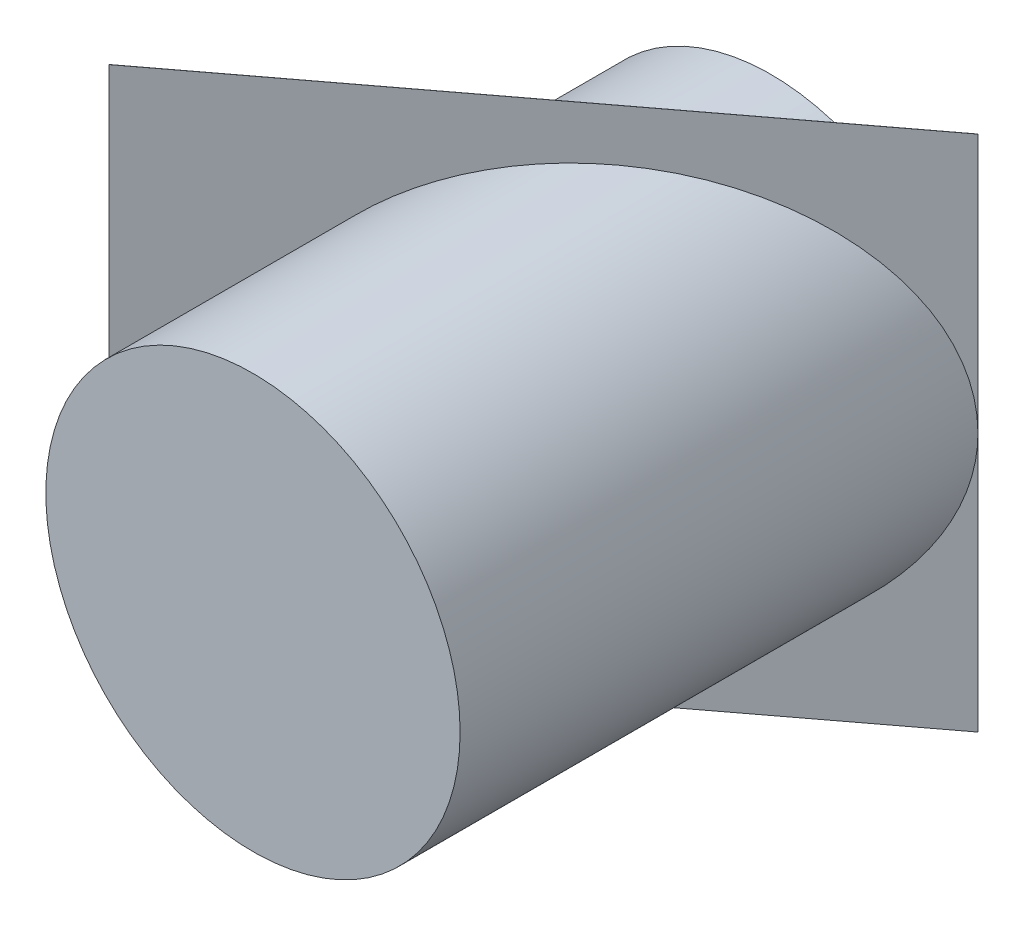
ISO-10303-21;
HEADER;
FILE_DESCRIPTION(('STEP AP214'),'2;1');
FILE_NAME('part.step','',(''),(''),'','','');
FILE_SCHEMA(('AUTOMOTIVE_DESIGN { 1 0 10303 214 1 1 1 1 }'));
ENDSEC;
DATA;
#1=APPLICATION_CONTEXT('core data for automotive mechanical design processes');
#2=APPLICATION_PROTOCOL_DEFINITION('international standard','automotive_design',2000,#1);
#3=PRODUCT_CONTEXT('',#1,'mechanical');
#4=PRODUCT('Part','Part','',(#3));
#5=PRODUCT_RELATED_PRODUCT_CATEGORY('part','',(#4));
#6=PRODUCT_DEFINITION_FORMATION('','',#4);
#7=PRODUCT_DEFINITION_CONTEXT('part definition',#1,'design');
#8=PRODUCT_DEFINITION('design','',#6,#7);
#9=PRODUCT_DEFINITION_SHAPE('','',#8);
#10=(LENGTH_UNIT() NAMED_UNIT(*) SI_UNIT(.MILLI.,.METRE.));
#11=(NAMED_UNIT(*) PLANE_ANGLE_UNIT() SI_UNIT($,.RADIAN.));
#12=(NAMED_UNIT(*) SI_UNIT($,.STERADIAN.) SOLID_ANGLE_UNIT());
#13=UNCERTAINTY_MEASURE_WITH_UNIT(LENGTH_MEASURE(1.E-05),#10,'distance_accuracy_value','');
#14=(GEOMETRIC_REPRESENTATION_CONTEXT(3) GLOBAL_UNCERTAINTY_ASSIGNED_CONTEXT((#13)) GLOBAL_UNIT_ASSIGNED_CONTEXT((#10,
#11,#12)) REPRESENTATION_CONTEXT('',''));
#15=CARTESIAN_POINT('',(0.,0.,0.));
#16=DIRECTION('',(0.,0.,1.));
#17=DIRECTION('',(1.,0.,0.));
#18=AXIS2_PLACEMENT_3D('',#15,#16,#17);
#19=CARTESIAN_POINT('',(0.,0.,50.));
#20=DIRECTION('',(0.,0.,-1.));
#21=DIRECTION('',(-1.,0.,0.));
#22=AXIS2_PLACEMENT_3D('',#19,#20,#21);
#23=CYLINDRICAL_SURFACE('',#22,20.);
#24=CARTESIAN_POINT('',(0.,0.,15.1304782298956));
#25=DIRECTION('',(0.603324589321637,0.,0.797495730345861));
#26=DIRECTION('',(0.797495730345861,0.,-0.603324589321637));
#27=AXIS2_PLACEMENT_3D('',#24,#25,#26);
#28=ELLIPSE('',#27,25.0785041712089,20.);
#29=CARTESIAN_POINT('',(20.,0.,0.));
#30=VERTEX_POINT('',#29);
#31=EDGE_CURVE('E103',#30,#30,#28,.T.);
#32=ORIENTED_EDGE('',*,*,#31,.T.);
#33=EDGE_LOOP('',(#32));
#34=FACE_BOUND('',#33,.T.);
#35=CARTESIAN_POINT('',(0.,0.,50.));
#36=DIRECTION('',(0.,0.,1.));
#37=DIRECTION('',(1.,0.,0.));
#38=AXIS2_PLACEMENT_3D('',#35,#36,#37);
#39=CIRCLE('',#38,20.);
#40=CARTESIAN_POINT('',(20.,0.,50.));
#41=VERTEX_POINT('',#40);
#42=EDGE_CURVE('E42',#41,#41,#39,.T.);
#43=ORIENTED_EDGE('',*,*,#42,.F.);
#44=EDGE_LOOP('',(#43));
#45=FACE_BOUND('',#44,.T.);
#46=ADVANCED_FACE('F35',(#34,#45),#23,.T.);
#47=CARTESIAN_POINT('',(0.,0.,50.));
#48=DIRECTION('',(0.,0.,1.));
#49=DIRECTION('',(1.,0.,0.));
#50=AXIS2_PLACEMENT_3D('',#47,#48,#49);
#51=PLANE('',#50);
#52=ORIENTED_EDGE('',*,*,#42,.T.);
#53=EDGE_LOOP('',(#52));
#54=FACE_BOUND('',#53,.T.);
#55=ADVANCED_FACE('F137',(#54),#51,.T.);
#56=CARTESIAN_POINT('',(19.9939667541068,25.,-0.00797495730345861));
#57=DIRECTION('',(0.603324589321637,0.,0.797495730345861));
#58=DIRECTION('',(0.797495730345861,0.,-0.603324589321637));
#59=AXIS2_PLACEMENT_3D('',#56,#57,#58);
#60=PLANE('',#59);
#61=DIRECTION('',(-0.797495730345861,0.,0.603324589321637));
#62=VECTOR('',#61,1.);
#63=CARTESIAN_POINT('',(19.9939667541068,-25.,-0.00797495730345861));
#64=LINE('',#63,#62);
#65=CARTESIAN_POINT('',(19.9939667541068,-25.,-0.00797495730345861));
#66=VERTEX_POINT('',#65);
#67=CARTESIAN_POINT('',(-27.7617690459737,-25.,36.1203810864847));
#68=VERTEX_POINT('',#67);
#69=EDGE_CURVE('E99',#66,#68,#64,.T.);
#70=ORIENTED_EDGE('',*,*,#69,.T.);
#71=DIRECTION('',(0.,-1.,0.));
#72=VECTOR('',#71,1.);
#73=CARTESIAN_POINT('',(-27.7617690459737,25.,36.1203810864847));
#74=LINE('',#73,#72);
#75=CARTESIAN_POINT('',(-27.7617690459737,25.,36.1203810864847));
#76=VERTEX_POINT('',#75);
#77=EDGE_CURVE('E95',#76,#68,#74,.T.);
#78=ORIENTED_EDGE('',*,*,#77,.F.);
#79=DIRECTION('',(-0.797495730345861,0.,0.603324589321637));
#80=VECTOR('',#79,1.);
#81=CARTESIAN_POINT('',(19.9939667541068,25.,-0.00797495730345861));
#82=LINE('',#81,#80);
#83=CARTESIAN_POINT('',(19.9939667541068,25.,-0.00797495730345861));
#84=VERTEX_POINT('',#83);
#85=EDGE_CURVE('E83',#84,#76,#82,.T.);
#86=ORIENTED_EDGE('',*,*,#85,.F.);
#87=DIRECTION('',(0.,-1.,0.));
#88=VECTOR('',#87,1.);
#89=CARTESIAN_POINT('',(19.9939667541068,25.,-0.00797495730345861));
#90=LINE('',#89,#88);
#91=EDGE_CURVE('E112',#84,#66,#90,.T.);
#92=ORIENTED_EDGE('',*,*,#91,.T.);
#93=EDGE_LOOP('',(#70,#78,#86,#92));
#94=FACE_BOUND('',#93,.T.);
#95=DIRECTION('',(0.,1.,0.));
#96=VECTOR('',#95,1.);
#97=CARTESIAN_POINT('',(19.9834251741484,0.,0.));
#98=LINE('',#97,#96);
#99=CARTESIAN_POINT('',(19.9834251741484,-0.814075125042166,0.));
#100=VERTEX_POINT('',#99);
#101=CARTESIAN_POINT('',(19.9834251741484,0.814075125042166,0.));
#102=VERTEX_POINT('',#101);
#103=EDGE_CURVE('E11',#100,#102,#98,.T.);
#104=ORIENTED_EDGE('',*,*,#103,.T.);
#105=CARTESIAN_POINT('',(0.,0.,15.11793897781));
#106=DIRECTION('',(0.603324589321637,0.,0.797495730345861));
#107=DIRECTION('',(0.797495730345861,0.,-0.603324589321637));
#108=AXIS2_PLACEMENT_3D('',#105,#106,#107);
#109=ELLIPSE('',#108,25.0785041712089,20.);
#110=EDGE_CURVE('E127',#102,#100,#109,.T.);
#111=ORIENTED_EDGE('',*,*,#110,.T.);
#112=EDGE_LOOP('',(#104,#111));
#113=FACE_BOUND('',#112,.T.);
#114=ADVANCED_FACE('F96',(#94,#113),#60,.F.);
#115=CARTESIAN_POINT('',(20.,25.,0.));
#116=DIRECTION('',(0.603324589321637,0.,0.797495730345861));
#117=DIRECTION('',(0.797495730345861,0.,-0.603324589321637));
#118=AXIS2_PLACEMENT_3D('',#115,#116,#117);
#119=PLANE('',#118);
#120=DIRECTION('',(0.,-1.,0.));
#121=VECTOR('',#120,1.);
#122=CARTESIAN_POINT('',(20.,25.,0.));
#123=LINE('',#122,#121);
#124=CARTESIAN_POINT('',(20.,-25.,0.));
#125=VERTEX_POINT('',#124);
#126=EDGE_CURVE('E122',#30,#125,#123,.T.);
#127=ORIENTED_EDGE('',*,*,#126,.F.);
#128=ORIENTED_EDGE('',*,*,#31,.F.);
#129=CARTESIAN_POINT('',(20.,25.,0.));
#130=VERTEX_POINT('',#129);
#131=EDGE_CURVE('E54',#130,#30,#123,.T.);
#132=ORIENTED_EDGE('',*,*,#131,.F.);
#133=DIRECTION('',(-0.797495730345861,0.,0.603324589321637));
#134=VECTOR('',#133,1.);
#135=CARTESIAN_POINT('',(20.,25.,0.));
#136=LINE('',#135,#134);
#137=CARTESIAN_POINT('',(-27.7557358000805,25.,36.1283560437881));
#138=VERTEX_POINT('',#137);
#139=EDGE_CURVE('E107',#130,#138,#136,.T.);
#140=ORIENTED_EDGE('',*,*,#139,.T.);
#141=DIRECTION('',(0.,-1.,0.));
#142=VECTOR('',#141,1.);
#143=CARTESIAN_POINT('',(-27.7557358000805,25.,36.1283560437881));
#144=LINE('',#143,#142);
#145=CARTESIAN_POINT('',(-27.7557358000805,-25.,36.1283560437881));
#146=VERTEX_POINT('',#145);
#147=EDGE_CURVE('E104',#138,#146,#144,.T.);
#148=ORIENTED_EDGE('',*,*,#147,.T.);
#149=DIRECTION('',(-0.797495730345861,0.,0.603324589321637));
#150=VECTOR('',#149,1.);
#151=CARTESIAN_POINT('',(20.,-25.,0.));
#152=LINE('',#151,#150);
#153=EDGE_CURVE('E116',#125,#146,#152,.T.);
#154=ORIENTED_EDGE('',*,*,#153,.F.);
#155=EDGE_LOOP('',(#127,#128,#132,#140,#148,#154));
#156=FACE_BOUND('',#155,.T.);
#157=ADVANCED_FACE('F136',(#156),#119,.T.);
#158=CARTESIAN_POINT('',(-27.7557358000805,25.,36.1283560437881));
#159=DIRECTION('',(-0.797495730345984,0.,0.603324589321474));
#160=DIRECTION('',(0.603324589321474,0.,0.797495730345984));
#161=AXIS2_PLACEMENT_3D('',#158,#159,#160);
#162=PLANE('',#161);
#163=DIRECTION('',(-0.603324589321474,0.,-0.797495730345984));
#164=VECTOR('',#163,1.);
#165=CARTESIAN_POINT('',(-27.7557358000805,-25.,36.1283560437881));
#166=LINE('',#165,#164);
#167=EDGE_CURVE('E114',#146,#68,#166,.T.);
#168=ORIENTED_EDGE('',*,*,#167,.F.);
#169=ORIENTED_EDGE('',*,*,#147,.F.);
#170=DIRECTION('',(-0.603324589321474,0.,-0.797495730345984));
#171=VECTOR('',#170,1.);
#172=CARTESIAN_POINT('',(-27.7557358000805,25.,36.1283560437881));
#173=LINE('',#172,#171);
#174=EDGE_CURVE('E88',#138,#76,#173,.T.);
#175=ORIENTED_EDGE('',*,*,#174,.T.);
#176=ORIENTED_EDGE('',*,*,#77,.T.);
#177=EDGE_LOOP('',(#168,#169,#175,#176));
#178=FACE_BOUND('',#177,.T.);
#179=ADVANCED_FACE('F106',(#178),#162,.T.);
#180=CARTESIAN_POINT('',(19.9939667541068,25.,-0.00797495730345861));
#181=DIRECTION('',(0.797495730345782,0.,-0.603324589321742));
#182=DIRECTION('',(-0.603324589321742,0.,-0.797495730345782));
#183=AXIS2_PLACEMENT_3D('',#180,#181,#182);
#184=PLANE('',#183);
#185=DIRECTION('',(0.603324589321742,0.,0.797495730345782));
#186=VECTOR('',#185,1.);
#187=CARTESIAN_POINT('',(19.9939667541068,-25.,-0.00797495730345861));
#188=LINE('',#187,#186);
#189=EDGE_CURVE('E92',#66,#125,#188,.T.);
#190=ORIENTED_EDGE('',*,*,#189,.F.);
#191=ORIENTED_EDGE('',*,*,#91,.F.);
#192=DIRECTION('',(0.603324589321742,0.,0.797495730345782));
#193=VECTOR('',#192,1.);
#194=CARTESIAN_POINT('',(19.9939667541068,25.,-0.00797495730345861));
#195=LINE('',#194,#193);
#196=EDGE_CURVE('E90',#84,#130,#195,.T.);
#197=ORIENTED_EDGE('',*,*,#196,.T.);
#198=ORIENTED_EDGE('',*,*,#131,.T.);
#199=ORIENTED_EDGE('',*,*,#126,.T.);
#200=EDGE_LOOP('',(#190,#191,#197,#198,#199));
#201=FACE_BOUND('',#200,.T.);
#202=ADVANCED_FACE('F167',(#201),#184,.T.);
#203=CARTESIAN_POINT('',(0.,25.,0.));
#204=DIRECTION('',(0.,-1.,0.));
#205=DIRECTION('',(-1.,0.,0.));
#206=AXIS2_PLACEMENT_3D('',#203,#204,#205);
#207=PLANE('',#206);
#208=ORIENTED_EDGE('',*,*,#85,.T.);
#209=ORIENTED_EDGE('',*,*,#174,.F.);
#210=ORIENTED_EDGE('',*,*,#139,.F.);
#211=ORIENTED_EDGE('',*,*,#196,.F.);
#212=EDGE_LOOP('',(#208,#209,#210,#211));
#213=FACE_BOUND('',#212,.T.);
#214=ADVANCED_FACE('F85',(#213),#207,.F.);
#215=CARTESIAN_POINT('',(0.,-25.,0.));
#216=DIRECTION('',(0.,-1.,0.));
#217=DIRECTION('',(-1.,0.,0.));
#218=AXIS2_PLACEMENT_3D('',#215,#216,#217);
#219=PLANE('',#218);
#220=ORIENTED_EDGE('',*,*,#69,.F.);
#221=ORIENTED_EDGE('',*,*,#189,.T.);
#222=ORIENTED_EDGE('',*,*,#153,.T.);
#223=ORIENTED_EDGE('',*,*,#167,.T.);
#224=EDGE_LOOP('',(#220,#221,#222,#223));
#225=FACE_BOUND('',#224,.T.);
#226=ADVANCED_FACE('F158',(#225),#219,.T.);
#227=CARTESIAN_POINT('',(0.,0.,0.));
#228=DIRECTION('',(0.,0.,1.));
#229=DIRECTION('',(1.,0.,0.));
#230=AXIS2_PLACEMENT_3D('',#227,#228,#229);
#231=PLANE('',#230);
#232=ORIENTED_EDGE('',*,*,#103,.F.);
#233=CARTESIAN_POINT('',(0.,0.,0.));
#234=DIRECTION('',(0.,0.,1.));
#235=DIRECTION('',(1.,0.,0.));
#236=AXIS2_PLACEMENT_3D('',#233,#234,#235);
#237=CIRCLE('',#236,20.);
#238=EDGE_CURVE('E130',#102,#100,#237,.T.);
#239=ORIENTED_EDGE('',*,*,#238,.F.);
#240=EDGE_LOOP('',(#232,#239));
#241=FACE_BOUND('',#240,.T.);
#242=ADVANCED_FACE('F154',(#241),#231,.F.);
#243=ORIENTED_EDGE('',*,*,#110,.F.);
#244=ORIENTED_EDGE('',*,*,#238,.T.);
#245=EDGE_LOOP('',(#243,#244));
#246=FACE_BOUND('',#245,.T.);
#247=ADVANCED_FACE('F134',(#246),#23,.T.);
#248=CLOSED_SHELL('',(#46,#55,#114,#157,#179,#202,#214,#226,#242,#247));
#249=MANIFOLD_SOLID_BREP('B2',#248);
#250=ADVANCED_BREP_SHAPE_REPRESENTATION('',(#18,#249),#14);
#251=SHAPE_DEFINITION_REPRESENTATION(#9,#250);
ENDSEC;
END-ISO-10303-21;
